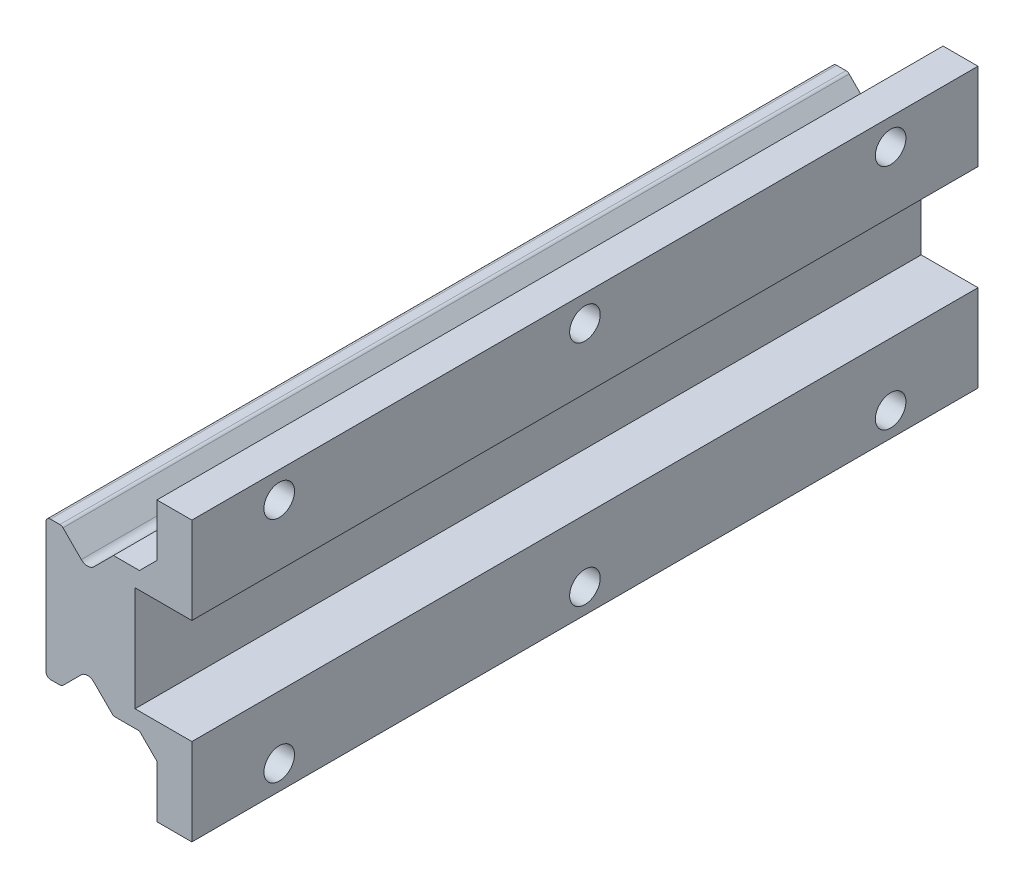
ISO-10303-21;
HEADER;
FILE_DESCRIPTION(('STEP AP214'),'2;1');
FILE_NAME('part.step','',(''),(''),'','','');
FILE_SCHEMA(('AUTOMOTIVE_DESIGN { 1 0 10303 214 1 1 1 1 }'));
ENDSEC;
DATA;
#1=APPLICATION_CONTEXT('core data for automotive mechanical design processes');
#2=APPLICATION_PROTOCOL_DEFINITION('international standard','automotive_design',2000,#1);
#3=PRODUCT_CONTEXT('',#1,'mechanical');
#4=PRODUCT('Part','Part','',(#3));
#5=PRODUCT_RELATED_PRODUCT_CATEGORY('part','',(#4));
#6=PRODUCT_DEFINITION_FORMATION('','',#4);
#7=PRODUCT_DEFINITION_CONTEXT('part definition',#1,'design');
#8=PRODUCT_DEFINITION('design','',#6,#7);
#9=PRODUCT_DEFINITION_SHAPE('','',#8);
#10=(LENGTH_UNIT() NAMED_UNIT(*) SI_UNIT(.MILLI.,.METRE.));
#11=(NAMED_UNIT(*) PLANE_ANGLE_UNIT() SI_UNIT($,.RADIAN.));
#12=(NAMED_UNIT(*) SI_UNIT($,.STERADIAN.) SOLID_ANGLE_UNIT());
#13=UNCERTAINTY_MEASURE_WITH_UNIT(LENGTH_MEASURE(1.E-05),#10,'distance_accuracy_value','');
#14=(GEOMETRIC_REPRESENTATION_CONTEXT(3) GLOBAL_UNCERTAINTY_ASSIGNED_CONTEXT((#13)) GLOBAL_UNIT_ASSIGNED_CONTEXT((#10,
#11,#12)) REPRESENTATION_CONTEXT('',''));
#15=CARTESIAN_POINT('',(0.,0.,0.));
#16=DIRECTION('',(0.,0.,1.));
#17=DIRECTION('',(1.,0.,0.));
#18=AXIS2_PLACEMENT_3D('',#15,#16,#17);
#19=CARTESIAN_POINT('',(-1.15262279942868E-12,21.1506288255981,90.));
#20=DIRECTION('',(0.,1.,0.));
#21=DIRECTION('',(-1.,0.,0.));
#22=AXIS2_PLACEMENT_3D('',#19,#20,#21);
#23=PLANE('',#22);
#24=DIRECTION('',(1.,0.,0.));
#25=VECTOR('',#24,1.);
#26=CARTESIAN_POINT('',(-1.15262279942868E-12,21.1506288255981,0.));
#27=LINE('',#26,#25);
#28=CARTESIAN_POINT('',(28.8995407666805,21.1506288255997,0.));
#29=VERTEX_POINT('',#28);
#30=CARTESIAN_POINT('',(29.9818347666805,21.1506288255997,0.));
#31=VERTEX_POINT('',#30);
#32=EDGE_CURVE('E245',#29,#31,#27,.T.);
#33=ORIENTED_EDGE('',*,*,#32,.F.);
#34=DIRECTION('',(0.,0.,-1.));
#35=VECTOR('',#34,1.);
#36=CARTESIAN_POINT('',(28.8995407666805,21.1506288255997,90.));
#37=LINE('',#36,#35);
#38=CARTESIAN_POINT('',(28.8995407666805,21.1506288255997,90.));
#39=VERTEX_POINT('',#38);
#40=EDGE_CURVE('E11',#39,#29,#37,.T.);
#41=ORIENTED_EDGE('',*,*,#40,.F.);
#42=DIRECTION('',(1.,0.,0.));
#43=VECTOR('',#42,1.);
#44=CARTESIAN_POINT('',(-1.15262279942868E-12,21.1506288255981,90.));
#45=LINE('',#44,#43);
#46=CARTESIAN_POINT('',(29.9818347666805,21.1506288255997,90.));
#47=VERTEX_POINT('',#46);
#48=EDGE_CURVE('E312',#39,#47,#45,.T.);
#49=ORIENTED_EDGE('',*,*,#48,.T.);
#50=DIRECTION('',(0.,0.,-1.));
#51=VECTOR('',#50,1.);
#52=CARTESIAN_POINT('',(29.9818347666805,21.1506288255997,90.));
#53=LINE('',#52,#51);
#54=EDGE_CURVE('E147',#47,#31,#53,.T.);
#55=ORIENTED_EDGE('',*,*,#54,.T.);
#56=EDGE_LOOP('',(#33,#41,#49,#55));
#57=FACE_BOUND('',#56,.T.);
#58=ADVANCED_FACE('F41',(#57),#23,.T.);
#59=CARTESIAN_POINT('',(28.8995407666806,20.6426288255997,90.));
#60=DIRECTION('',(0.,0.,-1.));
#61=DIRECTION('',(-1.,0.,0.));
#62=AXIS2_PLACEMENT_3D('',#59,#60,#61);
#63=CYLINDRICAL_SURFACE('',#62,0.507999999999979);
#64=CARTESIAN_POINT('',(28.8995407666806,20.6426288255997,0.));
#65=DIRECTION('',(0.,0.,1.));
#66=DIRECTION('',(1.,0.,0.));
#67=AXIS2_PLACEMENT_3D('',#64,#65,#66);
#68=CIRCLE('',#67,0.507999999999979);
#69=CARTESIAN_POINT('',(28.3915407666806,20.6426288255995,0.));
#70=VERTEX_POINT('',#69);
#71=EDGE_CURVE('E248',#29,#70,#68,.T.);
#72=ORIENTED_EDGE('',*,*,#71,.T.);
#73=DIRECTION('',(0.,0.,-1.));
#74=VECTOR('',#73,1.);
#75=CARTESIAN_POINT('',(28.3915407666806,20.6426288255995,90.));
#76=LINE('',#75,#74);
#77=CARTESIAN_POINT('',(28.3915407666806,20.6426288255995,90.));
#78=VERTEX_POINT('',#77);
#79=EDGE_CURVE('E50',#78,#70,#76,.T.);
#80=ORIENTED_EDGE('',*,*,#79,.F.);
#81=CARTESIAN_POINT('',(28.8995407666806,20.6426288255997,90.));
#82=DIRECTION('',(0.,0.,1.));
#83=DIRECTION('',(1.,0.,0.));
#84=AXIS2_PLACEMENT_3D('',#81,#82,#83);
#85=CIRCLE('',#84,0.507999999999979);
#86=EDGE_CURVE('E387',#39,#78,#85,.T.);
#87=ORIENTED_EDGE('',*,*,#86,.F.);
#88=ORIENTED_EDGE('',*,*,#40,.T.);
#89=EDGE_LOOP('',(#72,#80,#87,#88));
#90=FACE_BOUND('',#89,.T.);
#91=ADVANCED_FACE('F461',(#90),#63,.T.);
#92=CARTESIAN_POINT('',(28.3915407666806,0.,90.));
#93=DIRECTION('',(-1.,0.,0.));
#94=DIRECTION('',(0.,-1.,0.));
#95=AXIS2_PLACEMENT_3D('',#92,#93,#94);
#96=PLANE('',#95);
#97=DIRECTION('',(0.,1.,0.));
#98=VECTOR('',#97,1.);
#99=CARTESIAN_POINT('',(28.3915407666806,0.,0.));
#100=LINE('',#99,#98);
#101=CARTESIAN_POINT('',(28.3915407666806,5.74552882559949,0.));
#102=VERTEX_POINT('',#101);
#103=EDGE_CURVE('E252',#102,#70,#100,.T.);
#104=ORIENTED_EDGE('',*,*,#103,.F.);
#105=DIRECTION('',(0.,0.,-1.));
#106=VECTOR('',#105,1.);
#107=CARTESIAN_POINT('',(28.3915407666806,5.74552882559949,90.));
#108=LINE('',#107,#106);
#109=CARTESIAN_POINT('',(28.3915407666806,5.74552882559949,90.));
#110=VERTEX_POINT('',#109);
#111=EDGE_CURVE('E360',#110,#102,#108,.T.);
#112=ORIENTED_EDGE('',*,*,#111,.F.);
#113=DIRECTION('',(0.,1.,0.));
#114=VECTOR('',#113,1.);
#115=CARTESIAN_POINT('',(28.3915407666806,0.,90.));
#116=LINE('',#115,#114);
#117=EDGE_CURVE('E389',#110,#78,#116,.T.);
#118=ORIENTED_EDGE('',*,*,#117,.T.);
#119=ORIENTED_EDGE('',*,*,#79,.T.);
#120=EDGE_LOOP('',(#104,#112,#118,#119));
#121=FACE_BOUND('',#120,.T.);
#122=ADVANCED_FACE('F465',(#121),#96,.T.);
#123=CARTESIAN_POINT('',(28.8995407666807,5.7455288255997,90.));
#124=DIRECTION('',(0.,0.,-1.));
#125=DIRECTION('',(-1.,0.,0.));
#126=AXIS2_PLACEMENT_3D('',#123,#124,#125);
#127=CYLINDRICAL_SURFACE('',#126,0.508000000000067);
#128=CARTESIAN_POINT('',(28.8995407666807,5.7455288255997,0.));
#129=DIRECTION('',(0.,0.,1.));
#130=DIRECTION('',(1.,0.,0.));
#131=AXIS2_PLACEMENT_3D('',#128,#129,#130);
#132=CIRCLE('',#131,0.508000000000067);
#133=CARTESIAN_POINT('',(28.8995407666807,5.23752882559963,0.));
#134=VERTEX_POINT('',#133);
#135=EDGE_CURVE('E255',#102,#134,#132,.T.);
#136=ORIENTED_EDGE('',*,*,#135,.T.);
#137=DIRECTION('',(0.,0.,-1.));
#138=VECTOR('',#137,1.);
#139=CARTESIAN_POINT('',(28.8995407666807,5.23752882559963,90.));
#140=LINE('',#139,#138);
#141=CARTESIAN_POINT('',(28.8995407666807,5.23752882559963,90.));
#142=VERTEX_POINT('',#141);
#143=EDGE_CURVE('E357',#142,#134,#140,.T.);
#144=ORIENTED_EDGE('',*,*,#143,.F.);
#145=CARTESIAN_POINT('',(28.8995407666807,5.7455288255997,90.));
#146=DIRECTION('',(0.,0.,1.));
#147=DIRECTION('',(1.,0.,0.));
#148=AXIS2_PLACEMENT_3D('',#145,#146,#147);
#149=CIRCLE('',#148,0.508000000000067);
#150=EDGE_CURVE('E392',#110,#142,#149,.T.);
#151=ORIENTED_EDGE('',*,*,#150,.F.);
#152=ORIENTED_EDGE('',*,*,#111,.T.);
#153=EDGE_LOOP('',(#136,#144,#151,#152));
#154=FACE_BOUND('',#153,.T.);
#155=ADVANCED_FACE('F476',(#154),#127,.T.);
#156=CARTESIAN_POINT('',(-3.73569526708259E-13,5.23752882559757,90.));
#157=DIRECTION('',(0.,1.,0.));
#158=DIRECTION('',(-1.,0.,0.));
#159=AXIS2_PLACEMENT_3D('',#156,#157,#158);
#160=PLANE('',#159);
#161=DIRECTION('',(1.,0.,0.));
#162=VECTOR('',#161,1.);
#163=CARTESIAN_POINT('',(-3.73569526708259E-13,5.23752882559757,0.));
#164=LINE('',#163,#162);
#165=CARTESIAN_POINT('',(29.9818347666807,5.23752882559971,0.));
#166=VERTEX_POINT('',#165);
#167=EDGE_CURVE('E257',#134,#166,#164,.T.);
#168=ORIENTED_EDGE('',*,*,#167,.T.);
#169=DIRECTION('',(0.,0.,-1.));
#170=VECTOR('',#169,1.);
#171=CARTESIAN_POINT('',(29.9818347666807,5.23752882559971,90.));
#172=LINE('',#171,#170);
#173=CARTESIAN_POINT('',(29.9818347666807,5.23752882559971,90.));
#174=VERTEX_POINT('',#173);
#175=EDGE_CURVE('E354',#174,#166,#172,.T.);
#176=ORIENTED_EDGE('',*,*,#175,.F.);
#177=DIRECTION('',(1.,0.,0.));
#178=VECTOR('',#177,1.);
#179=CARTESIAN_POINT('',(-3.73569526708259E-13,5.23752882559757,90.));
#180=LINE('',#179,#178);
#181=EDGE_CURVE('E394',#142,#174,#180,.T.);
#182=ORIENTED_EDGE('',*,*,#181,.F.);
#183=ORIENTED_EDGE('',*,*,#143,.T.);
#184=EDGE_LOOP('',(#168,#176,#182,#183));
#185=FACE_BOUND('',#184,.T.);
#186=ADVANCED_FACE('F481',(#185),#160,.F.);
#187=CARTESIAN_POINT('',(29.9818347666803,5.74552882559983,90.));
#188=DIRECTION('',(0.,0.,-1.));
#189=DIRECTION('',(-1.,0.,0.));
#190=AXIS2_PLACEMENT_3D('',#187,#188,#189);
#191=CYLINDRICAL_SURFACE('',#190,0.508000000000126);
#192=CARTESIAN_POINT('',(29.9818347666803,5.74552882559983,0.));
#193=DIRECTION('',(0.,0.,1.));
#194=DIRECTION('',(1.,0.,0.));
#195=AXIS2_PLACEMENT_3D('',#192,#193,#194);
#196=CIRCLE('',#195,0.508000000000126);
#197=CARTESIAN_POINT('',(30.3410450115235,5.38631858075734,0.));
#198=VERTEX_POINT('',#197);
#199=EDGE_CURVE('E259',#166,#198,#196,.T.);
#200=ORIENTED_EDGE('',*,*,#199,.T.);
#201=DIRECTION('',(0.,0.,-1.));
#202=VECTOR('',#201,1.);
#203=CARTESIAN_POINT('',(30.3410450115235,5.38631858075734,90.));
#204=LINE('',#203,#202);
#205=CARTESIAN_POINT('',(30.3410450115235,5.38631858075734,90.));
#206=VERTEX_POINT('',#205);
#207=EDGE_CURVE('E351',#206,#198,#204,.T.);
#208=ORIENTED_EDGE('',*,*,#207,.F.);
#209=CARTESIAN_POINT('',(29.9818347666803,5.74552882559983,90.));
#210=DIRECTION('',(0.,0.,1.));
#211=DIRECTION('',(1.,0.,0.));
#212=AXIS2_PLACEMENT_3D('',#209,#210,#211);
#213=CIRCLE('',#212,0.508000000000126);
#214=EDGE_CURVE('E396',#174,#206,#213,.T.);
#215=ORIENTED_EDGE('',*,*,#214,.F.);
#216=ORIENTED_EDGE('',*,*,#175,.T.);
#217=EDGE_LOOP('',(#200,#208,#215,#216));
#218=FACE_BOUND('',#217,.T.);
#219=ADVANCED_FACE('F488',(#218),#191,.T.);
#220=CARTESIAN_POINT('',(12.4773632153842,-12.4773632153833,90.));
#221=DIRECTION('',(-0.707106781186574,0.707106781186521,0.));
#222=DIRECTION('',(-0.707106781186521,-0.707106781186574,0.));
#223=AXIS2_PLACEMENT_3D('',#220,#221,#222);
#224=PLANE('',#223);
#225=DIRECTION('',(0.707106781186521,0.707106781186574,0.));
#226=VECTOR('',#225,1.);
#227=CARTESIAN_POINT('',(12.4773632153842,-12.4773632153833,0.));
#228=LINE('',#227,#226);
#229=CARTESIAN_POINT('',(32.4356195174881,7.4808930867221,0.));
#230=VERTEX_POINT('',#229);
#231=EDGE_CURVE('E261',#198,#230,#228,.T.);
#232=ORIENTED_EDGE('',*,*,#231,.T.);
#233=DIRECTION('',(0.,0.,-1.));
#234=VECTOR('',#233,1.);
#235=CARTESIAN_POINT('',(32.4356195174881,7.4808930867221,90.));
#236=LINE('',#235,#234);
#237=CARTESIAN_POINT('',(32.4356195174881,7.4808930867221,90.));
#238=VERTEX_POINT('',#237);
#239=EDGE_CURVE('E349',#238,#230,#236,.T.);
#240=ORIENTED_EDGE('',*,*,#239,.F.);
#241=DIRECTION('',(0.707106781186521,0.707106781186574,0.));
#242=VECTOR('',#241,1.);
#243=CARTESIAN_POINT('',(12.4773632153842,-12.4773632153833,90.));
#244=LINE('',#243,#242);
#245=EDGE_CURVE('E398',#206,#238,#244,.T.);
#246=ORIENTED_EDGE('',*,*,#245,.F.);
#247=ORIENTED_EDGE('',*,*,#207,.T.);
#248=EDGE_LOOP('',(#232,#240,#246,#247));
#249=FACE_BOUND('',#248,.T.);
#250=ADVANCED_FACE('F492',(#249),#224,.F.);
#251=CARTESIAN_POINT('',(33.1497483329224,6.75820640843999,90.));
#252=DIRECTION('',(0.,0.,-1.));
#253=DIRECTION('',(-1.,0.,0.));
#254=AXIS2_PLACEMENT_3D('',#251,#252,#253);
#255=CYLINDRICAL_SURFACE('',#254,1.016);
#256=CARTESIAN_POINT('',(33.1497483329224,6.75820640843999,0.));
#257=DIRECTION('',(0.,0.,1.));
#258=DIRECTION('',(1.,0.,0.));
#259=AXIS2_PLACEMENT_3D('',#256,#257,#258);
#260=CIRCLE('',#259,1.016);
#261=CARTESIAN_POINT('',(33.870518646347,7.47426936327409,0.));
#262=VERTEX_POINT('',#261);
#263=EDGE_CURVE('E264',#262,#230,#260,.T.);
#264=ORIENTED_EDGE('',*,*,#263,.F.);
#265=DIRECTION('',(0.,0.,-1.));
#266=VECTOR('',#265,1.);
#267=CARTESIAN_POINT('',(33.870518646347,7.47426936327409,90.));
#268=LINE('',#267,#266);
#269=CARTESIAN_POINT('',(33.870518646347,7.47426936327409,90.));
#270=VERTEX_POINT('',#269);
#271=EDGE_CURVE('E347',#270,#262,#268,.T.);
#272=ORIENTED_EDGE('',*,*,#271,.F.);
#273=CARTESIAN_POINT('',(33.1497483329224,6.75820640843999,90.));
#274=DIRECTION('',(0.,0.,1.));
#275=DIRECTION('',(1.,0.,0.));
#276=AXIS2_PLACEMENT_3D('',#273,#274,#275);
#277=CIRCLE('',#276,1.016);
#278=EDGE_CURVE('E400',#270,#238,#277,.T.);
#279=ORIENTED_EDGE('',*,*,#278,.T.);
#280=ORIENTED_EDGE('',*,*,#239,.T.);
#281=EDGE_LOOP('',(#264,#272,#279,#280));
#282=FACE_BOUND('',#281,.T.);
#283=ADVANCED_FACE('F495',(#282),#255,.F.);
#284=CARTESIAN_POINT('',(20.6723940048104,20.6723940048106,90.));
#285=DIRECTION('',(-0.707106781186545,-0.70710678118655,0.));
#286=DIRECTION('',(0.70710678118655,-0.707106781186545,0.));
#287=AXIS2_PLACEMENT_3D('',#284,#285,#286);
#288=PLANE('',#287);
#289=DIRECTION('',(-0.70710678118655,0.707106781186545,0.));
#290=VECTOR('',#289,1.);
#291=CARTESIAN_POINT('',(20.6723940048104,20.6723940048106,0.));
#292=LINE('',#291,#290);
#293=CARTESIAN_POINT('',(36.1101127725489,5.23467523707221,0.));
#294=VERTEX_POINT('',#293);
#295=EDGE_CURVE('E267',#294,#262,#292,.T.);
#296=ORIENTED_EDGE('',*,*,#295,.F.);
#297=DIRECTION('',(0.,0.,-1.));
#298=VECTOR('',#297,1.);
#299=CARTESIAN_POINT('',(36.1101127725489,5.23467523707221,90.));
#300=LINE('',#299,#298);
#301=CARTESIAN_POINT('',(36.1101127725489,5.23467523707221,90.));
#302=VERTEX_POINT('',#301);
#303=EDGE_CURVE('E345',#302,#294,#300,.T.);
#304=ORIENTED_EDGE('',*,*,#303,.F.);
#305=DIRECTION('',(-0.70710678118655,0.707106781186545,0.));
#306=VECTOR('',#305,1.);
#307=CARTESIAN_POINT('',(20.6723940048104,20.6723940048106,90.));
#308=LINE('',#307,#306);
#309=EDGE_CURVE('E403',#302,#270,#308,.T.);
#310=ORIENTED_EDGE('',*,*,#309,.T.);
#311=ORIENTED_EDGE('',*,*,#271,.T.);
#312=EDGE_LOOP('',(#296,#304,#310,#311));
#313=FACE_BOUND('',#312,.T.);
#314=ADVANCED_FACE('F499',(#313),#288,.T.);
#315=CARTESIAN_POINT('',(0.,5.23467523707208,90.));
#316=DIRECTION('',(0.,1.,0.));
#317=DIRECTION('',(-1.,0.,0.));
#318=AXIS2_PLACEMENT_3D('',#315,#316,#317);
#319=PLANE('',#318);
#320=DIRECTION('',(1.,0.,0.));
#321=VECTOR('',#320,1.);
#322=CARTESIAN_POINT('',(0.,5.23467523707208,0.));
#323=LINE('',#322,#321);
#324=CARTESIAN_POINT('',(39.0915407666807,5.23467523707222,0.));
#325=VERTEX_POINT('',#324);
#326=EDGE_CURVE('E270',#294,#325,#323,.T.);
#327=ORIENTED_EDGE('',*,*,#326,.T.);
#328=DIRECTION('',(0.,0.,-1.));
#329=VECTOR('',#328,1.);
#330=CARTESIAN_POINT('',(39.0915407666807,5.23467523707222,90.));
#331=LINE('',#330,#329);
#332=CARTESIAN_POINT('',(39.0915407666807,5.23467523707222,90.));
#333=VERTEX_POINT('',#332);
#334=EDGE_CURVE('E342',#333,#325,#331,.T.);
#335=ORIENTED_EDGE('',*,*,#334,.F.);
#336=DIRECTION('',(1.,0.,0.));
#337=VECTOR('',#336,1.);
#338=CARTESIAN_POINT('',(0.,5.23467523707208,90.));
#339=LINE('',#338,#337);
#340=EDGE_CURVE('E406',#302,#333,#339,.T.);
#341=ORIENTED_EDGE('',*,*,#340,.F.);
#342=ORIENTED_EDGE('',*,*,#303,.T.);
#343=EDGE_LOOP('',(#327,#335,#341,#342));
#344=FACE_BOUND('',#343,.T.);
#345=ADVANCED_FACE('F504',(#344),#319,.F.);
#346=CARTESIAN_POINT('',(22.1806288194182,22.1607538273134,90.));
#347=DIRECTION('',(0.707423654270159,0.706789766040125,0.));
#348=DIRECTION('',(-0.706789766040125,0.707423654270159,0.));
#349=AXIS2_PLACEMENT_3D('',#346,#347,#348);
#350=PLANE('',#349);
#351=DIRECTION('',(0.706789766040125,-0.707423654270159,0.));
#352=VECTOR('',#351,1.);
#353=CARTESIAN_POINT('',(22.1806288194182,22.1607538273134,0.));
#354=LINE('',#353,#352);
#355=CARTESIAN_POINT('',(41.0897478601969,3.2346760407008,0.));
#356=VERTEX_POINT('',#355);
#357=EDGE_CURVE('E272',#325,#356,#354,.T.);
#358=ORIENTED_EDGE('',*,*,#357,.T.);
#359=DIRECTION('',(0.,0.,-1.));
#360=VECTOR('',#359,1.);
#361=CARTESIAN_POINT('',(41.0897478601969,3.2346760407008,90.));
#362=LINE('',#361,#360);
#363=CARTESIAN_POINT('',(41.0897478601969,3.2346760407008,90.));
#364=VERTEX_POINT('',#363);
#365=EDGE_CURVE('E339',#364,#356,#362,.T.);
#366=ORIENTED_EDGE('',*,*,#365,.F.);
#367=DIRECTION('',(0.706789766040125,-0.707423654270159,0.));
#368=VECTOR('',#367,1.);
#369=CARTESIAN_POINT('',(22.1806288194182,22.1607538273134,90.));
#370=LINE('',#369,#368);
#371=EDGE_CURVE('E408',#333,#364,#370,.T.);
#372=ORIENTED_EDGE('',*,*,#371,.F.);
#373=ORIENTED_EDGE('',*,*,#334,.T.);
#374=EDGE_LOOP('',(#358,#366,#372,#373));
#375=FACE_BOUND('',#374,.T.);
#376=ADVANCED_FACE('F510',(#375),#350,.F.);
#377=CARTESIAN_POINT('',(41.0868151046499,-0.0368324233995563,90.));
#378=DIRECTION('',(0.999999598185712,-0.000896453241896422,0.));
#379=DIRECTION('',(0.000896453241896423,0.999999598185712,0.));
#380=AXIS2_PLACEMENT_3D('',#377,#378,#379);
#381=PLANE('',#380);
#382=CARTESIAN_POINT('',(41.0868714983401,0.0260751158765747,80.0000000000001));
#383=DIRECTION('',(0.999999598185712,-0.000896453241896422,0.));
#384=DIRECTION('',(-0.000896453241896423,-0.999999598185712,0.));
#385=AXIS2_PLACEMENT_3D('',#382,#383,#384);
#386=ELLIPSE('',#385,1.7500007031753,1.75000000000001);
#387=CARTESIAN_POINT('',(41.0853027045364,-1.72392488412344,80.0000000000001));
#388=VERTEX_POINT('',#387);
#389=EDGE_CURVE('E249',#388,#388,#386,.T.);
#390=ORIENTED_EDGE('',*,*,#389,.T.);
#391=EDGE_LOOP('',(#390));
#392=FACE_BOUND('',#391,.T.);
#393=CARTESIAN_POINT('',(41.0868714983401,0.0260751158765747,45.0000000000001));
#394=DIRECTION('',(0.999999598185712,-0.000896453241896422,0.));
#395=DIRECTION('',(-0.000896453241896423,-0.999999598185712,0.));
#396=AXIS2_PLACEMENT_3D('',#393,#394,#395);
#397=ELLIPSE('',#396,1.75000070317529,1.75);
#398=CARTESIAN_POINT('',(41.0853027045364,-1.72392488412343,45.0000000000001));
#399=VERTEX_POINT('',#398);
#400=EDGE_CURVE('E375',#399,#399,#397,.T.);
#401=ORIENTED_EDGE('',*,*,#400,.T.);
#402=EDGE_LOOP('',(#401));
#403=FACE_BOUND('',#402,.T.);
#404=CARTESIAN_POINT('',(41.0868714983401,0.0260751158765747,10.0000000000001));
#405=DIRECTION('',(0.999999598185712,-0.000896453241896422,0.));
#406=DIRECTION('',(-0.000896453241896423,-0.999999598185712,0.));
#407=AXIS2_PLACEMENT_3D('',#404,#405,#406);
#408=ELLIPSE('',#407,1.75000070317529,1.75);
#409=CARTESIAN_POINT('',(41.0853027045364,-1.72392488412343,10.0000000000001));
#410=VERTEX_POINT('',#409);
#411=EDGE_CURVE('E371',#410,#410,#408,.T.);
#412=ORIENTED_EDGE('',*,*,#411,.T.);
#413=EDGE_LOOP('',(#412));
#414=FACE_BOUND('',#413,.T.);
#415=DIRECTION('',(-0.000896453241896422,-0.999999598185712,0.));
#416=VECTOR('',#415,1.);
#417=CARTESIAN_POINT('',(41.0868151046499,-0.0368324233995563,0.));
#418=LINE('',#417,#416);
#419=CARTESIAN_POINT('',(41.0843691385882,-2.76532395491638,0.));
#420=VERTEX_POINT('',#419);
#421=EDGE_CURVE('E274',#356,#420,#418,.T.);
#422=ORIENTED_EDGE('',*,*,#421,.T.);
#423=DIRECTION('',(0.,0.,-1.));
#424=VECTOR('',#423,1.);
#425=CARTESIAN_POINT('',(41.0843691385882,-2.76532395491638,90.));
#426=LINE('',#425,#424);
#427=CARTESIAN_POINT('',(41.0843691385882,-2.76532395491638,90.));
#428=VERTEX_POINT('',#427);
#429=EDGE_CURVE('E336',#428,#420,#426,.T.);
#430=ORIENTED_EDGE('',*,*,#429,.F.);
#431=DIRECTION('',(-0.000896453241896422,-0.999999598185712,0.));
#432=VECTOR('',#431,1.);
#433=CARTESIAN_POINT('',(41.0868151046499,-0.0368324233995563,90.));
#434=LINE('',#433,#432);
#435=EDGE_CURVE('E410',#364,#428,#434,.T.);
#436=ORIENTED_EDGE('',*,*,#435,.F.);
#437=ORIENTED_EDGE('',*,*,#365,.T.);
#438=EDGE_LOOP('',(#422,#430,#436,#437));
#439=FACE_BOUND('',#438,.T.);
#440=ADVANCED_FACE('F514',(#392,#403,#414,#439),#381,.F.);
#441=CARTESIAN_POINT('',(0.,-2.76532395491645,90.));
#442=DIRECTION('',(0.,1.,0.));
#443=DIRECTION('',(-1.,0.,0.));
#444=AXIS2_PLACEMENT_3D('',#441,#442,#443);
#445=PLANE('',#444);
#446=DIRECTION('',(1.,0.,0.));
#447=VECTOR('',#446,1.);
#448=CARTESIAN_POINT('',(0.,-2.76532395491645,0.));
#449=LINE('',#448,#447);
#450=CARTESIAN_POINT('',(45.0915407666807,-2.76532395491637,0.));
#451=VERTEX_POINT('',#450);
#452=EDGE_CURVE('E276',#420,#451,#449,.T.);
#453=ORIENTED_EDGE('',*,*,#452,.T.);
#454=DIRECTION('',(0.,0.,-1.));
#455=VECTOR('',#454,1.);
#456=CARTESIAN_POINT('',(45.0915407666807,-2.76532395491637,90.));
#457=LINE('',#456,#455);
#458=CARTESIAN_POINT('',(45.0915407666807,-2.76532395491637,90.));
#459=VERTEX_POINT('',#458);
#460=EDGE_CURVE('E334',#459,#451,#457,.T.);
#461=ORIENTED_EDGE('',*,*,#460,.F.);
#462=DIRECTION('',(1.,0.,0.));
#463=VECTOR('',#462,1.);
#464=CARTESIAN_POINT('',(0.,-2.76532395491645,90.));
#465=LINE('',#464,#463);
#466=EDGE_CURVE('E412',#428,#459,#465,.T.);
#467=ORIENTED_EDGE('',*,*,#466,.F.);
#468=ORIENTED_EDGE('',*,*,#429,.T.);
#469=EDGE_LOOP('',(#453,#461,#467,#468));
#470=FACE_BOUND('',#469,.T.);
#471=ADVANCED_FACE('F519',(#470),#445,.F.);
#472=CARTESIAN_POINT('',(45.0915407666807,0.,90.));
#473=DIRECTION('',(1.,0.,0.));
#474=DIRECTION('',(0.,0.,-1.));
#475=AXIS2_PLACEMENT_3D('',#472,#473,#474);
#476=PLANE('',#475);
#477=CARTESIAN_POINT('',(45.0915407666807,0.0260751158765376,80.0000000000001));
#478=DIRECTION('',(-1.,0.,0.));
#479=DIRECTION('',(0.,-1.,0.));
#480=AXIS2_PLACEMENT_3D('',#477,#478,#479);
#481=CIRCLE('',#480,1.75000000000001);
#482=CARTESIAN_POINT('',(45.0915407666807,-1.72392488412347,80.0000000000001));
#483=VERTEX_POINT('',#482);
#484=EDGE_CURVE('E579',#483,#483,#481,.T.);
#485=ORIENTED_EDGE('',*,*,#484,.T.);
#486=EDGE_LOOP('',(#485));
#487=FACE_BOUND('',#486,.T.);
#488=CARTESIAN_POINT('',(45.0915407666807,0.0260751158765376,45.0000000000001));
#489=DIRECTION('',(-1.,0.,0.));
#490=DIRECTION('',(0.,-1.,0.));
#491=AXIS2_PLACEMENT_3D('',#488,#489,#490);
#492=CIRCLE('',#491,1.75);
#493=CARTESIAN_POINT('',(45.0915407666807,-1.72392488412347,45.0000000000001));
#494=VERTEX_POINT('',#493);
#495=EDGE_CURVE('E581',#494,#494,#492,.T.);
#496=ORIENTED_EDGE('',*,*,#495,.T.);
#497=EDGE_LOOP('',(#496));
#498=FACE_BOUND('',#497,.T.);
#499=CARTESIAN_POINT('',(45.0915407666807,0.0260751158765376,10.0000000000001));
#500=DIRECTION('',(-1.,0.,0.));
#501=DIRECTION('',(0.,-1.,0.));
#502=AXIS2_PLACEMENT_3D('',#499,#500,#501);
#503=CIRCLE('',#502,1.75);
#504=CARTESIAN_POINT('',(45.0915407666807,-1.72392488412346,10.0000000000001));
#505=VERTEX_POINT('',#504);
#506=EDGE_CURVE('E366',#505,#505,#503,.T.);
#507=ORIENTED_EDGE('',*,*,#506,.T.);
#508=EDGE_LOOP('',(#507));
#509=FACE_BOUND('',#508,.T.);
#510=DIRECTION('',(0.,-1.,0.));
#511=VECTOR('',#510,1.);
#512=CARTESIAN_POINT('',(45.0915407666807,0.,0.));
#513=LINE('',#512,#511);
#514=CARTESIAN_POINT('',(45.0915407666807,7.19122513826502,0.));
#515=VERTEX_POINT('',#514);
#516=EDGE_CURVE('E279',#515,#451,#513,.T.);
#517=ORIENTED_EDGE('',*,*,#516,.F.);
#518=DIRECTION('',(0.,0.,-1.));
#519=VECTOR('',#518,1.);
#520=CARTESIAN_POINT('',(45.0915407666807,7.19122513826502,90.));
#521=LINE('',#520,#519);
#522=CARTESIAN_POINT('',(45.0915407666807,7.19122513826502,90.));
#523=VERTEX_POINT('',#522);
#524=EDGE_CURVE('E332',#523,#515,#521,.T.);
#525=ORIENTED_EDGE('',*,*,#524,.F.);
#526=DIRECTION('',(0.,-1.,0.));
#527=VECTOR('',#526,1.);
#528=CARTESIAN_POINT('',(45.0915407666807,0.,90.));
#529=LINE('',#528,#527);
#530=EDGE_CURVE('E414',#523,#459,#529,.T.);
#531=ORIENTED_EDGE('',*,*,#530,.T.);
#532=ORIENTED_EDGE('',*,*,#460,.T.);
#533=EDGE_LOOP('',(#517,#525,#531,#532));
#534=FACE_BOUND('',#533,.T.);
#535=ADVANCED_FACE('F547',(#487,#498,#509,#534),#476,.T.);
#536=CARTESIAN_POINT('',(0.,7.19122513826502,90.));
#537=DIRECTION('',(0.,1.,0.));
#538=DIRECTION('',(0.,0.,1.));
#539=AXIS2_PLACEMENT_3D('',#536,#537,#538);
#540=PLANE('',#539);
#541=DIRECTION('',(1.,0.,0.));
#542=VECTOR('',#541,1.);
#543=CARTESIAN_POINT('',(0.,7.19122513826502,0.));
#544=LINE('',#543,#542);
#545=CARTESIAN_POINT('',(38.5915407666807,7.19122513826502,0.));
#546=VERTEX_POINT('',#545);
#547=EDGE_CURVE('E282',#546,#515,#544,.T.);
#548=ORIENTED_EDGE('',*,*,#547,.F.);
#549=DIRECTION('',(0.,0.,-1.));
#550=VECTOR('',#549,1.);
#551=CARTESIAN_POINT('',(38.5915407666807,7.19122513826502,90.));
#552=LINE('',#551,#550);
#553=CARTESIAN_POINT('',(38.5915407666807,7.19122513826502,90.));
#554=VERTEX_POINT('',#553);
#555=EDGE_CURVE('E330',#554,#546,#552,.T.);
#556=ORIENTED_EDGE('',*,*,#555,.F.);
#557=DIRECTION('',(1.,0.,0.));
#558=VECTOR('',#557,1.);
#559=CARTESIAN_POINT('',(0.,7.19122513826502,90.));
#560=LINE('',#559,#558);
#561=EDGE_CURVE('E417',#554,#523,#560,.T.);
#562=ORIENTED_EDGE('',*,*,#561,.T.);
#563=ORIENTED_EDGE('',*,*,#524,.T.);
#564=EDGE_LOOP('',(#548,#556,#562,#563));
#565=FACE_BOUND('',#564,.T.);
#566=ADVANCED_FACE('F526',(#565),#540,.T.);
#567=CARTESIAN_POINT('',(38.5915407666807,0.,90.));
#568=DIRECTION('',(1.,0.,0.));
#569=DIRECTION('',(0.,0.,-1.));
#570=AXIS2_PLACEMENT_3D('',#567,#568,#569);
#571=PLANE('',#570);
#572=DIRECTION('',(0.,-1.,0.));
#573=VECTOR('',#572,1.);
#574=CARTESIAN_POINT('',(38.5915407666807,0.,0.));
#575=LINE('',#574,#573);
#576=CARTESIAN_POINT('',(38.5915407666807,19.191225138265,0.));
#577=VERTEX_POINT('',#576);
#578=EDGE_CURVE('E286',#577,#546,#575,.T.);
#579=ORIENTED_EDGE('',*,*,#578,.F.);
#580=DIRECTION('',(0.,0.,-1.));
#581=VECTOR('',#580,1.);
#582=CARTESIAN_POINT('',(38.5915407666807,19.191225138265,90.));
#583=LINE('',#582,#581);
#584=CARTESIAN_POINT('',(38.5915407666807,19.191225138265,90.));
#585=VERTEX_POINT('',#584);
#586=EDGE_CURVE('E328',#585,#577,#583,.T.);
#587=ORIENTED_EDGE('',*,*,#586,.F.);
#588=DIRECTION('',(0.,-1.,0.));
#589=VECTOR('',#588,1.);
#590=CARTESIAN_POINT('',(38.5915407666807,0.,90.));
#591=LINE('',#590,#589);
#592=EDGE_CURVE('E421',#585,#554,#591,.T.);
#593=ORIENTED_EDGE('',*,*,#592,.T.);
#594=ORIENTED_EDGE('',*,*,#555,.T.);
#595=EDGE_LOOP('',(#579,#587,#593,#594));
#596=FACE_BOUND('',#595,.T.);
#597=ADVANCED_FACE('F530',(#596),#571,.T.);
#598=CARTESIAN_POINT('',(0.,19.191225138265,90.));
#599=DIRECTION('',(0.,1.,0.));
#600=DIRECTION('',(0.,0.,1.));
#601=AXIS2_PLACEMENT_3D('',#598,#599,#600);
#602=PLANE('',#601);
#603=DIRECTION('',(1.,0.,0.));
#604=VECTOR('',#603,1.);
#605=CARTESIAN_POINT('',(0.,19.191225138265,0.));
#606=LINE('',#605,#604);
#607=CARTESIAN_POINT('',(45.0915407666807,19.191225138265,0.));
#608=VERTEX_POINT('',#607);
#609=EDGE_CURVE('E289',#577,#608,#606,.T.);
#610=ORIENTED_EDGE('',*,*,#609,.T.);
#611=DIRECTION('',(0.,0.,-1.));
#612=VECTOR('',#611,1.);
#613=CARTESIAN_POINT('',(45.0915407666807,19.191225138265,90.));
#614=LINE('',#613,#612);
#615=CARTESIAN_POINT('',(45.0915407666807,19.191225138265,90.));
#616=VERTEX_POINT('',#615);
#617=EDGE_CURVE('E326',#616,#608,#614,.T.);
#618=ORIENTED_EDGE('',*,*,#617,.F.);
#619=DIRECTION('',(1.,0.,0.));
#620=VECTOR('',#619,1.);
#621=CARTESIAN_POINT('',(0.,19.191225138265,90.));
#622=LINE('',#621,#620);
#623=EDGE_CURVE('E424',#585,#616,#622,.T.);
#624=ORIENTED_EDGE('',*,*,#623,.F.);
#625=ORIENTED_EDGE('',*,*,#586,.T.);
#626=EDGE_LOOP('',(#610,#618,#624,#625));
#627=FACE_BOUND('',#626,.T.);
#628=ADVANCED_FACE('F536',(#627),#602,.F.);
#629=CARTESIAN_POINT('',(45.0915407666809,26.1477752370722,9.99999999999998));
#630=DIRECTION('',(-1.,0.,0.));
#631=DIRECTION('',(0.,-1.,0.));
#632=AXIS2_PLACEMENT_3D('',#629,#630,#631);
#633=CIRCLE('',#632,1.75);
#634=CARTESIAN_POINT('',(45.0915407666809,24.3977752370722,9.99999999999998));
#635=VERTEX_POINT('',#634);
#636=EDGE_CURVE('E570',#635,#635,#633,.T.);
#637=ORIENTED_EDGE('',*,*,#636,.T.);
#638=EDGE_LOOP('',(#637));
#639=FACE_BOUND('',#638,.T.);
#640=CARTESIAN_POINT('',(45.0915407666809,26.1477752370722,80.));
#641=DIRECTION('',(-1.,0.,0.));
#642=DIRECTION('',(0.,-1.,0.));
#643=AXIS2_PLACEMENT_3D('',#640,#641,#642);
#644=CIRCLE('',#643,1.75000000000001);
#645=CARTESIAN_POINT('',(45.0915407666809,24.3977752370722,80.));
#646=VERTEX_POINT('',#645);
#647=EDGE_CURVE('E574',#646,#646,#644,.T.);
#648=ORIENTED_EDGE('',*,*,#647,.T.);
#649=EDGE_LOOP('',(#648));
#650=FACE_BOUND('',#649,.T.);
#651=CARTESIAN_POINT('',(45.0915407666809,26.1477752370722,45.));
#652=DIRECTION('',(-1.,0.,0.));
#653=DIRECTION('',(0.,-1.,0.));
#654=AXIS2_PLACEMENT_3D('',#651,#652,#653);
#655=CIRCLE('',#654,1.75);
#656=CARTESIAN_POINT('',(45.0915407666809,24.3977752370722,45.));
#657=VERTEX_POINT('',#656);
#658=EDGE_CURVE('E577',#657,#657,#655,.T.);
#659=ORIENTED_EDGE('',*,*,#658,.T.);
#660=EDGE_LOOP('',(#659));
#661=FACE_BOUND('',#660,.T.);
#662=CARTESIAN_POINT('',(45.0915407666807,29.1477752370722,0.));
#663=VERTEX_POINT('',#662);
#664=EDGE_CURVE('E283',#663,#608,#513,.T.);
#665=ORIENTED_EDGE('',*,*,#664,.F.);
#666=DIRECTION('',(0.,0.,-1.));
#667=VECTOR('',#666,1.);
#668=CARTESIAN_POINT('',(45.0915407666807,29.1477752370722,90.));
#669=LINE('',#668,#667);
#670=CARTESIAN_POINT('',(45.0915407666807,29.1477752370722,90.));
#671=VERTEX_POINT('',#670);
#672=EDGE_CURVE('E324',#671,#663,#669,.T.);
#673=ORIENTED_EDGE('',*,*,#672,.F.);
#674=EDGE_CURVE('E418',#671,#616,#529,.T.);
#675=ORIENTED_EDGE('',*,*,#674,.T.);
#676=ORIENTED_EDGE('',*,*,#617,.T.);
#677=EDGE_LOOP('',(#665,#673,#675,#676));
#678=FACE_BOUND('',#677,.T.);
#679=ADVANCED_FACE('F541',(#639,#650,#661,#678),#476,.T.);
#680=CARTESIAN_POINT('',(0.,29.1477752370722,90.));
#681=DIRECTION('',(0.,1.,0.));
#682=DIRECTION('',(0.,0.,1.));
#683=AXIS2_PLACEMENT_3D('',#680,#681,#682);
#684=PLANE('',#683);
#685=DIRECTION('',(1.,0.,0.));
#686=VECTOR('',#685,1.);
#687=CARTESIAN_POINT('',(0.,29.1477752370722,0.));
#688=LINE('',#687,#686);
#689=CARTESIAN_POINT('',(41.0915407666807,29.1477752370722,0.));
#690=VERTEX_POINT('',#689);
#691=EDGE_CURVE('E292',#690,#663,#688,.T.);
#692=ORIENTED_EDGE('',*,*,#691,.F.);
#693=DIRECTION('',(0.,0.,-1.));
#694=VECTOR('',#693,1.);
#695=CARTESIAN_POINT('',(41.0915407666807,29.1477752370722,90.));
#696=LINE('',#695,#694);
#697=CARTESIAN_POINT('',(41.0915407666807,29.1477752370722,90.));
#698=VERTEX_POINT('',#697);
#699=EDGE_CURVE('E322',#698,#690,#696,.T.);
#700=ORIENTED_EDGE('',*,*,#699,.F.);
#701=DIRECTION('',(1.,0.,0.));
#702=VECTOR('',#701,1.);
#703=CARTESIAN_POINT('',(0.,29.1477752370722,90.));
#704=LINE('',#703,#702);
#705=EDGE_CURVE('E426',#698,#671,#704,.T.);
#706=ORIENTED_EDGE('',*,*,#705,.T.);
#707=ORIENTED_EDGE('',*,*,#672,.T.);
#708=EDGE_LOOP('',(#692,#700,#706,#707));
#709=FACE_BOUND('',#708,.T.);
#710=ADVANCED_FACE('F544',(#709),#684,.T.);
#711=CARTESIAN_POINT('',(41.0915407666804,-3.80173122304098E-13,90.));
#712=DIRECTION('',(-1.,0.,0.));
#713=DIRECTION('',(0.,-1.,0.));
#714=AXIS2_PLACEMENT_3D('',#711,#712,#713);
#715=PLANE('',#714);
#716=CARTESIAN_POINT('',(41.0915407666806,26.1477752370722,9.99999999999998));
#717=DIRECTION('',(-1.,0.,0.));
#718=DIRECTION('',(0.,-1.,0.));
#719=AXIS2_PLACEMENT_3D('',#716,#717,#718);
#720=CIRCLE('',#719,1.75);
#721=CARTESIAN_POINT('',(41.0915407666806,24.3977752370722,9.99999999999998));
#722=VERTEX_POINT('',#721);
#723=EDGE_CURVE('E44',#722,#722,#720,.T.);
#724=ORIENTED_EDGE('',*,*,#723,.F.);
#725=EDGE_LOOP('',(#724));
#726=FACE_BOUND('',#725,.T.);
#727=CARTESIAN_POINT('',(41.0915407666806,26.1477752370722,80.));
#728=DIRECTION('',(-1.,0.,0.));
#729=DIRECTION('',(0.,-1.,0.));
#730=AXIS2_PLACEMENT_3D('',#727,#728,#729);
#731=CIRCLE('',#730,1.75000000000001);
#732=CARTESIAN_POINT('',(41.0915407666806,24.3977752370722,80.));
#733=VERTEX_POINT('',#732);
#734=EDGE_CURVE('E365',#733,#733,#731,.T.);
#735=ORIENTED_EDGE('',*,*,#734,.F.);
#736=EDGE_LOOP('',(#735));
#737=FACE_BOUND('',#736,.T.);
#738=CARTESIAN_POINT('',(41.0915407666806,26.1477752370722,45.));
#739=DIRECTION('',(-1.,0.,0.));
#740=DIRECTION('',(0.,-1.,0.));
#741=AXIS2_PLACEMENT_3D('',#738,#739,#740);
#742=CIRCLE('',#741,1.75);
#743=CARTESIAN_POINT('',(41.0915407666806,24.3977752370722,45.));
#744=VERTEX_POINT('',#743);
#745=EDGE_CURVE('E363',#744,#744,#742,.T.);
#746=ORIENTED_EDGE('',*,*,#745,.F.);
#747=EDGE_LOOP('',(#746));
#748=FACE_BOUND('',#747,.T.);
#749=DIRECTION('',(0.,1.,0.));
#750=VECTOR('',#749,1.);
#751=CARTESIAN_POINT('',(41.0915407666804,-3.80173122304098E-13,0.));
#752=LINE('',#751,#750);
#753=CARTESIAN_POINT('',(41.0915407666806,23.1477752370722,0.));
#754=VERTEX_POINT('',#753);
#755=EDGE_CURVE('E295',#754,#690,#752,.T.);
#756=ORIENTED_EDGE('',*,*,#755,.F.);
#757=DIRECTION('',(0.,0.,-1.));
#758=VECTOR('',#757,1.);
#759=CARTESIAN_POINT('',(41.0915407666806,23.1477752370722,90.));
#760=LINE('',#759,#758);
#761=CARTESIAN_POINT('',(41.0915407666806,23.1477752370722,90.));
#762=VERTEX_POINT('',#761);
#763=EDGE_CURVE('E320',#762,#754,#760,.T.);
#764=ORIENTED_EDGE('',*,*,#763,.F.);
#765=DIRECTION('',(0.,1.,0.));
#766=VECTOR('',#765,1.);
#767=CARTESIAN_POINT('',(41.0915407666804,-3.80173122304098E-13,90.));
#768=LINE('',#767,#766);
#769=EDGE_CURVE('E429',#762,#698,#768,.T.);
#770=ORIENTED_EDGE('',*,*,#769,.T.);
#771=ORIENTED_EDGE('',*,*,#699,.T.);
#772=EDGE_LOOP('',(#756,#764,#770,#771));
#773=FACE_BOUND('',#772,.T.);
#774=ADVANCED_FACE('F546',(#726,#737,#748,#773),#715,.T.);
#775=CARTESIAN_POINT('',(8.97188276480408,-8.97188276480413,90.));
#776=DIRECTION('',(-0.707106781186546,0.707106781186549,0.));
#777=DIRECTION('',(-0.707106781186549,-0.707106781186546,0.));
#778=AXIS2_PLACEMENT_3D('',#775,#776,#777);
#779=PLANE('',#778);
#780=DIRECTION('',(0.707106781186549,0.707106781186546,0.));
#781=VECTOR('',#780,1.);
#782=CARTESIAN_POINT('',(8.97188276480408,-8.97188276480413,0.));
#783=LINE('',#782,#781);
#784=CARTESIAN_POINT('',(39.0915407666806,21.1477752370722,0.));
#785=VERTEX_POINT('',#784);
#786=EDGE_CURVE('E298',#785,#754,#783,.T.);
#787=ORIENTED_EDGE('',*,*,#786,.F.);
#788=DIRECTION('',(0.,0.,-1.));
#789=VECTOR('',#788,1.);
#790=CARTESIAN_POINT('',(39.0915407666806,21.1477752370722,90.));
#791=LINE('',#790,#789);
#792=CARTESIAN_POINT('',(39.0915407666806,21.1477752370722,90.));
#793=VERTEX_POINT('',#792);
#794=EDGE_CURVE('E318',#793,#785,#791,.T.);
#795=ORIENTED_EDGE('',*,*,#794,.F.);
#796=DIRECTION('',(0.707106781186549,0.707106781186546,0.));
#797=VECTOR('',#796,1.);
#798=CARTESIAN_POINT('',(8.97188276480408,-8.97188276480413,90.));
#799=LINE('',#798,#797);
#800=EDGE_CURVE('E432',#793,#762,#799,.T.);
#801=ORIENTED_EDGE('',*,*,#800,.T.);
#802=ORIENTED_EDGE('',*,*,#763,.T.);
#803=EDGE_LOOP('',(#787,#795,#801,#802));
#804=FACE_BOUND('',#803,.T.);
#805=ADVANCED_FACE('F445',(#804),#779,.T.);
#806=CARTESIAN_POINT('',(0.,21.147775237072,90.));
#807=DIRECTION('',(0.,1.,0.));
#808=DIRECTION('',(-1.,0.,0.));
#809=AXIS2_PLACEMENT_3D('',#806,#807,#808);
#810=PLANE('',#809);
#811=DIRECTION('',(1.,0.,0.));
#812=VECTOR('',#811,1.);
#813=CARTESIAN_POINT('',(0.,21.147775237072,0.));
#814=LINE('',#813,#812);
#815=CARTESIAN_POINT('',(36.1129700016306,21.1477752370722,0.));
#816=VERTEX_POINT('',#815);
#817=EDGE_CURVE('E301',#816,#785,#814,.T.);
#818=ORIENTED_EDGE('',*,*,#817,.F.);
#819=DIRECTION('',(0.,0.,-1.));
#820=VECTOR('',#819,1.);
#821=CARTESIAN_POINT('',(36.1129700016306,21.1477752370722,90.));
#822=LINE('',#821,#820);
#823=CARTESIAN_POINT('',(36.1129700016306,21.1477752370722,90.));
#824=VERTEX_POINT('',#823);
#825=EDGE_CURVE('E316',#824,#816,#822,.T.);
#826=ORIENTED_EDGE('',*,*,#825,.F.);
#827=DIRECTION('',(1.,0.,0.));
#828=VECTOR('',#827,1.);
#829=CARTESIAN_POINT('',(0.,21.147775237072,90.));
#830=LINE('',#829,#828);
#831=EDGE_CURVE('E435',#824,#793,#830,.T.);
#832=ORIENTED_EDGE('',*,*,#831,.T.);
#833=ORIENTED_EDGE('',*,*,#794,.T.);
#834=EDGE_LOOP('',(#818,#826,#832,#833));
#835=FACE_BOUND('',#834,.T.);
#836=ADVANCED_FACE('F439',(#835),#810,.T.);
#837=CARTESIAN_POINT('',(7.48259738227944,-7.48259738227934,90.));
#838=DIRECTION('',(0.707106781186552,-0.707106781186543,0.));
#839=DIRECTION('',(0.707106781186543,0.707106781186552,0.));
#840=AXIS2_PLACEMENT_3D('',#837,#838,#839);
#841=PLANE('',#840);
#842=DIRECTION('',(-0.707106781186543,-0.707106781186552,0.));
#843=VECTOR('',#842,1.);
#844=CARTESIAN_POINT('',(7.48259738227944,-7.48259738227934,0.));
#845=LINE('',#844,#843);
#846=CARTESIAN_POINT('',(33.8733758754288,18.9081811108703,0.));
#847=VERTEX_POINT('',#846);
#848=EDGE_CURVE('E304',#816,#847,#845,.T.);
#849=ORIENTED_EDGE('',*,*,#848,.T.);
#850=DIRECTION('',(0.,0.,-1.));
#851=VECTOR('',#850,1.);
#852=CARTESIAN_POINT('',(33.8733758754288,18.9081811108703,90.));
#853=LINE('',#852,#851);
#854=CARTESIAN_POINT('',(33.8733758754288,18.9081811108703,90.));
#855=VERTEX_POINT('',#854);
#856=EDGE_CURVE('E231',#855,#847,#853,.T.);
#857=ORIENTED_EDGE('',*,*,#856,.F.);
#858=DIRECTION('',(-0.707106781186543,-0.707106781186552,0.));
#859=VECTOR('',#858,1.);
#860=CARTESIAN_POINT('',(7.48259738227944,-7.48259738227934,90.));
#861=LINE('',#860,#859);
#862=EDGE_CURVE('E237',#824,#855,#861,.T.);
#863=ORIENTED_EDGE('',*,*,#862,.F.);
#864=ORIENTED_EDGE('',*,*,#825,.T.);
#865=EDGE_LOOP('',(#849,#857,#863,#864));
#866=FACE_BOUND('',#865,.T.);
#867=ADVANCED_FACE('F451',(#866),#841,.F.);
#868=CARTESIAN_POINT('',(33.1540400071736,19.6256850541638,90.));
#869=DIRECTION('',(0.,0.,-1.));
#870=DIRECTION('',(-1.,0.,0.));
#871=AXIS2_PLACEMENT_3D('',#868,#869,#870);
#872=CYLINDRICAL_SURFACE('',#871,1.01599999999999);
#873=CARTESIAN_POINT('',(33.1540400071736,19.6256850541638,0.));
#874=DIRECTION('',(0.,0.,1.));
#875=DIRECTION('',(1.,0.,0.));
#876=AXIS2_PLACEMENT_3D('',#873,#874,#875);
#877=CIRCLE('',#876,1.01599999999999);
#878=CARTESIAN_POINT('',(32.4356195174882,18.9072645644782,0.));
#879=VERTEX_POINT('',#878);
#880=EDGE_CURVE('E226',#879,#847,#877,.T.);
#881=ORIENTED_EDGE('',*,*,#880,.F.);
#882=DIRECTION('',(0.,0.,-1.));
#883=VECTOR('',#882,1.);
#884=CARTESIAN_POINT('',(32.4356195174882,18.9072645644782,90.));
#885=LINE('',#884,#883);
#886=CARTESIAN_POINT('',(32.4356195174882,18.9072645644782,90.));
#887=VERTEX_POINT('',#886);
#888=EDGE_CURVE('E221',#887,#879,#885,.T.);
#889=ORIENTED_EDGE('',*,*,#888,.F.);
#890=CARTESIAN_POINT('',(33.1540400071736,19.6256850541638,90.));
#891=DIRECTION('',(0.,0.,1.));
#892=DIRECTION('',(1.,0.,0.));
#893=AXIS2_PLACEMENT_3D('',#890,#891,#892);
#894=CIRCLE('',#893,1.01599999999999);
#895=EDGE_CURVE('E224',#887,#855,#894,.T.);
#896=ORIENTED_EDGE('',*,*,#895,.T.);
#897=ORIENTED_EDGE('',*,*,#856,.T.);
#898=EDGE_LOOP('',(#881,#889,#896,#897));
#899=FACE_BOUND('',#898,.T.);
#900=ADVANCED_FACE('F223',(#899),#872,.F.);
#901=CARTESIAN_POINT('',(25.6714420409819,25.6714420409839,90.));
#902=DIRECTION('',(0.707106781186519,0.707106781186576,0.));
#903=DIRECTION('',(-0.707106781186576,0.707106781186519,0.));
#904=AXIS2_PLACEMENT_3D('',#901,#902,#903);
#905=PLANE('',#904);
#906=DIRECTION('',(0.707106781186576,-0.707106781186519,0.));
#907=VECTOR('',#906,1.);
#908=CARTESIAN_POINT('',(25.6714420409819,25.6714420409839,0.));
#909=LINE('',#908,#907);
#910=CARTESIAN_POINT('',(30.3410450115234,21.0018390704429,0.));
#911=VERTEX_POINT('',#910);
#912=EDGE_CURVE('E308',#911,#879,#909,.T.);
#913=ORIENTED_EDGE('',*,*,#912,.F.);
#914=DIRECTION('',(0.,0.,-1.));
#915=VECTOR('',#914,1.);
#916=CARTESIAN_POINT('',(30.3410450115234,21.0018390704429,90.));
#917=LINE('',#916,#915);
#918=CARTESIAN_POINT('',(30.3410450115234,21.0018390704429,90.));
#919=VERTEX_POINT('',#918);
#920=EDGE_CURVE('E140',#919,#911,#917,.T.);
#921=ORIENTED_EDGE('',*,*,#920,.F.);
#922=DIRECTION('',(0.707106781186576,-0.707106781186519,0.));
#923=VECTOR('',#922,1.);
#924=CARTESIAN_POINT('',(25.6714420409819,25.6714420409839,90.));
#925=LINE('',#924,#923);
#926=EDGE_CURVE('E234',#919,#887,#925,.T.);
#927=ORIENTED_EDGE('',*,*,#926,.T.);
#928=ORIENTED_EDGE('',*,*,#888,.T.);
#929=EDGE_LOOP('',(#913,#921,#927,#928));
#930=FACE_BOUND('',#929,.T.);
#931=ADVANCED_FACE('F240',(#930),#905,.T.);
#932=CARTESIAN_POINT('',(29.981834766681,20.6426288255998,90.));
#933=DIRECTION('',(0.,0.,-1.));
#934=DIRECTION('',(-1.,0.,0.));
#935=AXIS2_PLACEMENT_3D('',#932,#933,#934);
#936=CYLINDRICAL_SURFACE('',#935,0.507999999999968);
#937=CARTESIAN_POINT('',(29.981834766681,20.6426288255998,0.));
#938=DIRECTION('',(0.,0.,1.));
#939=DIRECTION('',(1.,0.,0.));
#940=AXIS2_PLACEMENT_3D('',#937,#938,#939);
#941=CIRCLE('',#940,0.507999999999968);
#942=EDGE_CURVE('E310',#911,#31,#941,.T.);
#943=ORIENTED_EDGE('',*,*,#942,.T.);
#944=ORIENTED_EDGE('',*,*,#54,.F.);
#945=CARTESIAN_POINT('',(29.981834766681,20.6426288255998,90.));
#946=DIRECTION('',(0.,0.,1.));
#947=DIRECTION('',(1.,0.,0.));
#948=AXIS2_PLACEMENT_3D('',#945,#946,#947);
#949=CIRCLE('',#948,0.507999999999968);
#950=EDGE_CURVE('E59',#919,#47,#949,.T.);
#951=ORIENTED_EDGE('',*,*,#950,.F.);
#952=ORIENTED_EDGE('',*,*,#920,.T.);
#953=EDGE_LOOP('',(#943,#944,#951,#952));
#954=FACE_BOUND('',#953,.T.);
#955=ADVANCED_FACE('F610',(#954),#936,.T.);
#956=CARTESIAN_POINT('',(0.,0.,90.));
#957=DIRECTION('',(0.,0.,1.));
#958=DIRECTION('',(1.,0.,0.));
#959=AXIS2_PLACEMENT_3D('',#956,#957,#958);
#960=PLANE('',#959);
#961=ORIENTED_EDGE('',*,*,#48,.F.);
#962=ORIENTED_EDGE('',*,*,#86,.T.);
#963=ORIENTED_EDGE('',*,*,#117,.F.);
#964=ORIENTED_EDGE('',*,*,#150,.T.);
#965=ORIENTED_EDGE('',*,*,#181,.T.);
#966=ORIENTED_EDGE('',*,*,#214,.T.);
#967=ORIENTED_EDGE('',*,*,#245,.T.);
#968=ORIENTED_EDGE('',*,*,#278,.F.);
#969=ORIENTED_EDGE('',*,*,#309,.F.);
#970=ORIENTED_EDGE('',*,*,#340,.T.);
#971=ORIENTED_EDGE('',*,*,#371,.T.);
#972=ORIENTED_EDGE('',*,*,#435,.T.);
#973=ORIENTED_EDGE('',*,*,#466,.T.);
#974=ORIENTED_EDGE('',*,*,#530,.F.);
#975=ORIENTED_EDGE('',*,*,#561,.F.);
#976=ORIENTED_EDGE('',*,*,#592,.F.);
#977=ORIENTED_EDGE('',*,*,#623,.T.);
#978=ORIENTED_EDGE('',*,*,#674,.F.);
#979=ORIENTED_EDGE('',*,*,#705,.F.);
#980=ORIENTED_EDGE('',*,*,#769,.F.);
#981=ORIENTED_EDGE('',*,*,#800,.F.);
#982=ORIENTED_EDGE('',*,*,#831,.F.);
#983=ORIENTED_EDGE('',*,*,#862,.T.);
#984=ORIENTED_EDGE('',*,*,#895,.F.);
#985=ORIENTED_EDGE('',*,*,#926,.F.);
#986=ORIENTED_EDGE('',*,*,#950,.T.);
#987=EDGE_LOOP('',(#961,#962,#963,#964,#965,#966,#967,#968,#969,#970,#971,#972,#973,#974,#975,
#976,#977,#978,#979,#980,#981,#982,#983,#984,#985,#986));
#988=FACE_BOUND('',#987,.T.);
#989=ADVANCED_FACE('F233',(#988),#960,.T.);
#990=CARTESIAN_POINT('',(0.,0.,0.));
#991=DIRECTION('',(0.,0.,1.));
#992=DIRECTION('',(1.,0.,0.));
#993=AXIS2_PLACEMENT_3D('',#990,#991,#992);
#994=PLANE('',#993);
#995=ORIENTED_EDGE('',*,*,#32,.T.);
#996=ORIENTED_EDGE('',*,*,#942,.F.);
#997=ORIENTED_EDGE('',*,*,#912,.T.);
#998=ORIENTED_EDGE('',*,*,#880,.T.);
#999=ORIENTED_EDGE('',*,*,#848,.F.);
#1000=ORIENTED_EDGE('',*,*,#817,.T.);
#1001=ORIENTED_EDGE('',*,*,#786,.T.);
#1002=ORIENTED_EDGE('',*,*,#755,.T.);
#1003=ORIENTED_EDGE('',*,*,#691,.T.);
#1004=ORIENTED_EDGE('',*,*,#664,.T.);
#1005=ORIENTED_EDGE('',*,*,#609,.F.);
#1006=ORIENTED_EDGE('',*,*,#578,.T.);
#1007=ORIENTED_EDGE('',*,*,#547,.T.);
#1008=ORIENTED_EDGE('',*,*,#516,.T.);
#1009=ORIENTED_EDGE('',*,*,#452,.F.);
#1010=ORIENTED_EDGE('',*,*,#421,.F.);
#1011=ORIENTED_EDGE('',*,*,#357,.F.);
#1012=ORIENTED_EDGE('',*,*,#326,.F.);
#1013=ORIENTED_EDGE('',*,*,#295,.T.);
#1014=ORIENTED_EDGE('',*,*,#263,.T.);
#1015=ORIENTED_EDGE('',*,*,#231,.F.);
#1016=ORIENTED_EDGE('',*,*,#199,.F.);
#1017=ORIENTED_EDGE('',*,*,#167,.F.);
#1018=ORIENTED_EDGE('',*,*,#135,.F.);
#1019=ORIENTED_EDGE('',*,*,#103,.T.);
#1020=ORIENTED_EDGE('',*,*,#71,.F.);
#1021=EDGE_LOOP('',(#995,#996,#997,#998,#999,#1000,#1001,#1002,#1003,#1004,#1005,#1006,#1007,
#1008,#1009,#1010,#1011,#1012,#1013,#1014,#1015,#1016,#1017,#1018,#1019,#1020));
#1022=FACE_BOUND('',#1021,.T.);
#1023=ADVANCED_FACE('F449',(#1022),#994,.F.);
#1024=CARTESIAN_POINT('',(45.0915407666809,26.1477752370722,45.));
#1025=DIRECTION('',(-1.,0.,0.));
#1026=DIRECTION('',(0.,-1.,0.));
#1027=AXIS2_PLACEMENT_3D('',#1024,#1025,#1026);
#1028=CYLINDRICAL_SURFACE('',#1027,1.75);
#1029=ORIENTED_EDGE('',*,*,#745,.T.);
#1030=EDGE_LOOP('',(#1029));
#1031=FACE_BOUND('',#1030,.T.);
#1032=ORIENTED_EDGE('',*,*,#658,.F.);
#1033=EDGE_LOOP('',(#1032));
#1034=FACE_BOUND('',#1033,.T.);
#1035=ADVANCED_FACE('F613',(#1031,#1034),#1028,.F.);
#1036=CARTESIAN_POINT('',(45.0915407666809,26.1477752370722,80.));
#1037=DIRECTION('',(-1.,0.,0.));
#1038=DIRECTION('',(0.,-1.,0.));
#1039=AXIS2_PLACEMENT_3D('',#1036,#1037,#1038);
#1040=CYLINDRICAL_SURFACE('',#1039,1.75000000000001);
#1041=ORIENTED_EDGE('',*,*,#734,.T.);
#1042=EDGE_LOOP('',(#1041));
#1043=FACE_BOUND('',#1042,.T.);
#1044=ORIENTED_EDGE('',*,*,#647,.F.);
#1045=EDGE_LOOP('',(#1044));
#1046=FACE_BOUND('',#1045,.T.);
#1047=ADVANCED_FACE('F604',(#1043,#1046),#1040,.F.);
#1048=CARTESIAN_POINT('',(45.0915407666809,26.1477752370722,9.99999999999998));
#1049=DIRECTION('',(-1.,0.,0.));
#1050=DIRECTION('',(0.,-1.,0.));
#1051=AXIS2_PLACEMENT_3D('',#1048,#1049,#1050);
#1052=CYLINDRICAL_SURFACE('',#1051,1.75);
#1053=ORIENTED_EDGE('',*,*,#723,.T.);
#1054=EDGE_LOOP('',(#1053));
#1055=FACE_BOUND('',#1054,.T.);
#1056=ORIENTED_EDGE('',*,*,#636,.F.);
#1057=EDGE_LOOP('',(#1056));
#1058=FACE_BOUND('',#1057,.T.);
#1059=ADVANCED_FACE('F595',(#1055,#1058),#1052,.F.);
#1060=CARTESIAN_POINT('',(45.0915407666807,0.0260751158765376,10.0000000000001));
#1061=DIRECTION('',(-1.,0.,0.));
#1062=DIRECTION('',(0.,-1.,0.));
#1063=AXIS2_PLACEMENT_3D('',#1060,#1061,#1062);
#1064=CYLINDRICAL_SURFACE('',#1063,1.75);
#1065=ORIENTED_EDGE('',*,*,#506,.F.);
#1066=EDGE_LOOP('',(#1065));
#1067=FACE_BOUND('',#1066,.T.);
#1068=ORIENTED_EDGE('',*,*,#411,.F.);
#1069=EDGE_LOOP('',(#1068));
#1070=FACE_BOUND('',#1069,.T.);
#1071=ADVANCED_FACE('F591',(#1067,#1070),#1064,.F.);
#1072=CARTESIAN_POINT('',(45.0915407666807,0.0260751158765376,45.0000000000001));
#1073=DIRECTION('',(-1.,0.,0.));
#1074=DIRECTION('',(0.,-1.,0.));
#1075=AXIS2_PLACEMENT_3D('',#1072,#1073,#1074);
#1076=CYLINDRICAL_SURFACE('',#1075,1.75);
#1077=ORIENTED_EDGE('',*,*,#495,.F.);
#1078=EDGE_LOOP('',(#1077));
#1079=FACE_BOUND('',#1078,.T.);
#1080=ORIENTED_EDGE('',*,*,#400,.F.);
#1081=EDGE_LOOP('',(#1080));
#1082=FACE_BOUND('',#1081,.T.);
#1083=ADVANCED_FACE('F594',(#1079,#1082),#1076,.F.);
#1084=CARTESIAN_POINT('',(45.0915407666807,0.0260751158765376,80.0000000000001));
#1085=DIRECTION('',(-1.,0.,0.));
#1086=DIRECTION('',(0.,-1.,0.));
#1087=AXIS2_PLACEMENT_3D('',#1084,#1085,#1086);
#1088=CYLINDRICAL_SURFACE('',#1087,1.75000000000001);
#1089=ORIENTED_EDGE('',*,*,#484,.F.);
#1090=EDGE_LOOP('',(#1089));
#1091=FACE_BOUND('',#1090,.T.);
#1092=ORIENTED_EDGE('',*,*,#389,.F.);
#1093=EDGE_LOOP('',(#1092));
#1094=FACE_BOUND('',#1093,.T.);
#1095=ADVANCED_FACE('F601',(#1091,#1094),#1088,.F.);
#1096=CLOSED_SHELL('',(#58,#91,#122,#155,#186,#219,#250,#283,#314,#345,#376,#440,#471,#535,#566,
#597,#628,#679,#710,#774,#805,#836,#867,#900,#931,#955,#989,#1023,#1035,#1047,#1059,#1071,#1083,#1095));
#1097=MANIFOLD_SOLID_BREP('B2',#1096);
#1098=ADVANCED_BREP_SHAPE_REPRESENTATION('',(#18,#1097),#14);
#1099=SHAPE_DEFINITION_REPRESENTATION(#9,#1098);
ENDSEC;
END-ISO-10303-21;
